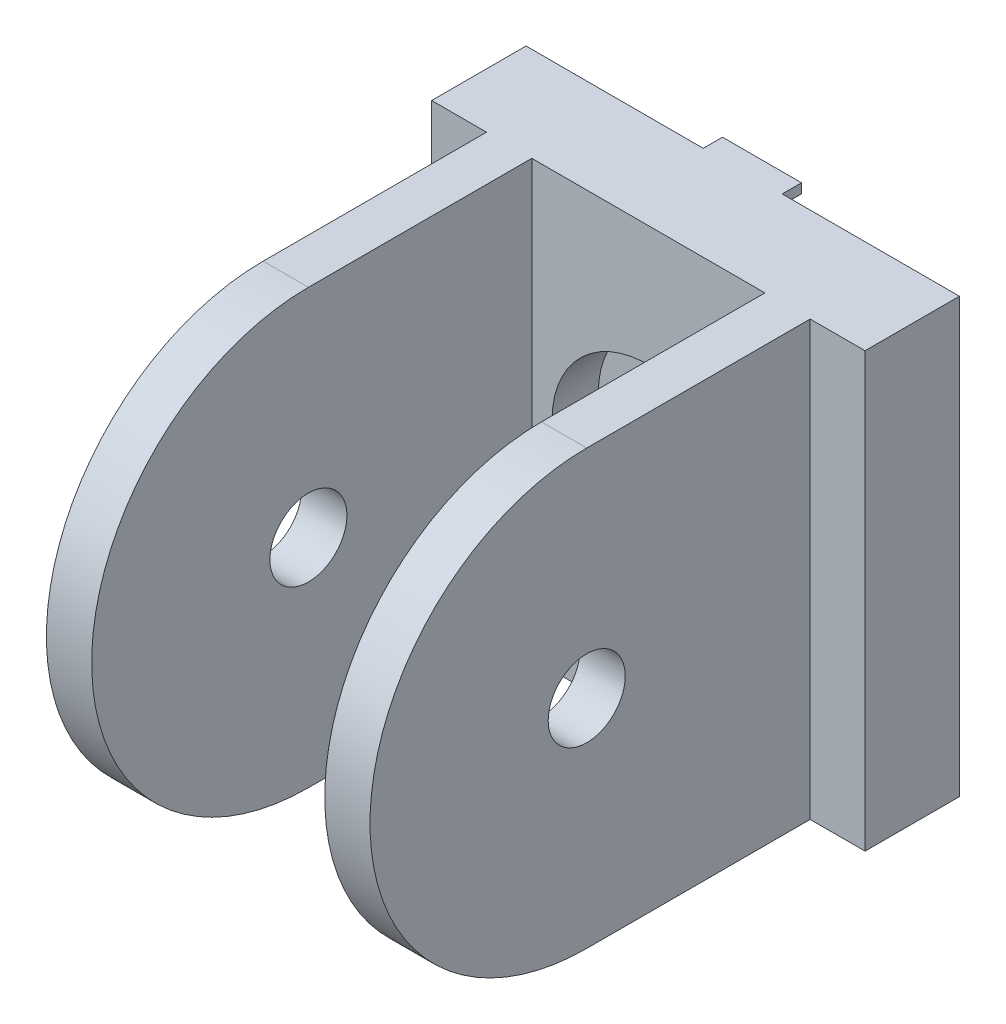
ISO-10303-21;
HEADER;
FILE_DESCRIPTION(('STEP AP214'),'2;1');
FILE_NAME('part.step','',(''),(''),'','','');
FILE_SCHEMA(('AUTOMOTIVE_DESIGN { 1 0 10303 214 1 1 1 1 }'));
ENDSEC;
DATA;
#1=APPLICATION_CONTEXT('core data for automotive mechanical design processes');
#2=APPLICATION_PROTOCOL_DEFINITION('international standard','automotive_design',2000,#1);
#3=PRODUCT_CONTEXT('',#1,'mechanical');
#4=PRODUCT('Part','Part','',(#3));
#5=PRODUCT_RELATED_PRODUCT_CATEGORY('part','',(#4));
#6=PRODUCT_DEFINITION_FORMATION('','',#4);
#7=PRODUCT_DEFINITION_CONTEXT('part definition',#1,'design');
#8=PRODUCT_DEFINITION('design','',#6,#7);
#9=PRODUCT_DEFINITION_SHAPE('','',#8);
#10=(LENGTH_UNIT() NAMED_UNIT(*) SI_UNIT(.MILLI.,.METRE.));
#11=(NAMED_UNIT(*) PLANE_ANGLE_UNIT() SI_UNIT($,.RADIAN.));
#12=(NAMED_UNIT(*) SI_UNIT($,.STERADIAN.) SOLID_ANGLE_UNIT());
#13=UNCERTAINTY_MEASURE_WITH_UNIT(LENGTH_MEASURE(1.E-05),#10,'distance_accuracy_value','');
#14=(GEOMETRIC_REPRESENTATION_CONTEXT(3) GLOBAL_UNCERTAINTY_ASSIGNED_CONTEXT((#13)) GLOBAL_UNIT_ASSIGNED_CONTEXT((#10,
#11,#12)) REPRESENTATION_CONTEXT('',''));
#15=CARTESIAN_POINT('',(0.,0.,0.));
#16=DIRECTION('',(0.,0.,1.));
#17=DIRECTION('',(1.,0.,0.));
#18=AXIS2_PLACEMENT_3D('',#15,#16,#17);
#19=CARTESIAN_POINT('',(0.,0.,0.));
#20=DIRECTION('',(0.,0.,1.));
#21=DIRECTION('',(1.,0.,0.));
#22=AXIS2_PLACEMENT_3D('',#19,#20,#21);
#23=CYLINDRICAL_SURFACE('',#22,6.1);
#24=CARTESIAN_POINT('',(0.,0.,0.));
#25=DIRECTION('',(0.,0.,1.));
#26=DIRECTION('',(1.,0.,0.));
#27=AXIS2_PLACEMENT_3D('',#24,#25,#26);
#28=CIRCLE('',#27,6.1);
#29=CARTESIAN_POINT('',(6.1,0.,0.));
#30=VERTEX_POINT('',#29);
#31=EDGE_CURVE('E317',#30,#30,#28,.T.);
#32=ORIENTED_EDGE('',*,*,#31,.F.);
#33=EDGE_LOOP('',(#32));
#34=FACE_BOUND('',#33,.T.);
#35=CARTESIAN_POINT('',(0.,0.,5.));
#36=DIRECTION('',(0.,0.,1.));
#37=DIRECTION('',(1.,0.,0.));
#38=AXIS2_PLACEMENT_3D('',#35,#36,#37);
#39=CIRCLE('',#38,6.1);
#40=CARTESIAN_POINT('',(6.1,0.,5.));
#41=VERTEX_POINT('',#40);
#42=EDGE_CURVE('E37',#41,#41,#39,.F.);
#43=ORIENTED_EDGE('',*,*,#42,.F.);
#44=EDGE_LOOP('',(#43));
#45=FACE_BOUND('',#44,.T.);
#46=ADVANCED_FACE('F33',(#34,#45),#23,.F.);
#47=CARTESIAN_POINT('',(22.5,22.5,0.));
#48=DIRECTION('',(0.,0.,-1.));
#49=DIRECTION('',(-1.,0.,0.));
#50=AXIS2_PLACEMENT_3D('',#47,#48,#49);
#51=PLANE('',#50);
#52=ORIENTED_EDGE('',*,*,#31,.T.);
#53=EDGE_LOOP('',(#52));
#54=FACE_BOUND('',#53,.T.);
#55=DIRECTION('',(1.,0.,0.));
#56=VECTOR('',#55,1.);
#57=CARTESIAN_POINT('',(4.09999999999999,-21.5,0.));
#58=LINE('',#57,#56);
#59=CARTESIAN_POINT('',(-4.09999999999999,-21.5,0.));
#60=VERTEX_POINT('',#59);
#61=CARTESIAN_POINT('',(4.1,-21.5,0.));
#62=VERTEX_POINT('',#61);
#63=EDGE_CURVE('E430',#60,#62,#58,.T.);
#64=ORIENTED_EDGE('',*,*,#63,.F.);
#65=DIRECTION('',(0.,1.,0.));
#66=VECTOR('',#65,1.);
#67=CARTESIAN_POINT('',(-4.09999999999999,-22.5,0.));
#68=LINE('',#67,#66);
#69=CARTESIAN_POINT('',(-4.09999999999999,-22.5,0.));
#70=VERTEX_POINT('',#69);
#71=EDGE_CURVE('E428',#70,#60,#68,.T.);
#72=ORIENTED_EDGE('',*,*,#71,.F.);
#73=DIRECTION('',(1.,0.,0.));
#74=VECTOR('',#73,1.);
#75=CARTESIAN_POINT('',(-22.5,-22.5,0.));
#76=LINE('',#75,#74);
#77=CARTESIAN_POINT('',(-22.5,-22.5,0.));
#78=VERTEX_POINT('',#77);
#79=EDGE_CURVE('E198',#78,#70,#76,.T.);
#80=ORIENTED_EDGE('',*,*,#79,.F.);
#81=DIRECTION('',(0.,-1.,0.));
#82=VECTOR('',#81,1.);
#83=CARTESIAN_POINT('',(-22.5,-22.5,0.));
#84=LINE('',#83,#82);
#85=CARTESIAN_POINT('',(-22.5,22.5,0.));
#86=VERTEX_POINT('',#85);
#87=EDGE_CURVE('E253',#86,#78,#84,.T.);
#88=ORIENTED_EDGE('',*,*,#87,.F.);
#89=DIRECTION('',(-1.,0.,0.));
#90=VECTOR('',#89,1.);
#91=CARTESIAN_POINT('',(-22.5,22.5,0.));
#92=LINE('',#91,#90);
#93=CARTESIAN_POINT('',(-4.10000000000001,22.5,0.));
#94=VERTEX_POINT('',#93);
#95=EDGE_CURVE('E243',#94,#86,#92,.T.);
#96=ORIENTED_EDGE('',*,*,#95,.F.);
#97=DIRECTION('',(0.,1.,0.));
#98=VECTOR('',#97,1.);
#99=CARTESIAN_POINT('',(-4.1,22.5,0.));
#100=LINE('',#99,#98);
#101=CARTESIAN_POINT('',(-4.1,21.5,0.));
#102=VERTEX_POINT('',#101);
#103=EDGE_CURVE('E210',#102,#94,#100,.T.);
#104=ORIENTED_EDGE('',*,*,#103,.F.);
#105=DIRECTION('',(-1.,0.,0.));
#106=VECTOR('',#105,1.);
#107=CARTESIAN_POINT('',(4.1,21.5,0.));
#108=LINE('',#107,#106);
#109=CARTESIAN_POINT('',(4.1,21.5,0.));
#110=VERTEX_POINT('',#109);
#111=EDGE_CURVE('E58',#110,#102,#108,.T.);
#112=ORIENTED_EDGE('',*,*,#111,.F.);
#113=DIRECTION('',(0.,-1.,0.));
#114=VECTOR('',#113,1.);
#115=CARTESIAN_POINT('',(4.1,22.5,0.));
#116=LINE('',#115,#114);
#117=CARTESIAN_POINT('',(4.09999999999999,22.5,0.));
#118=VERTEX_POINT('',#117);
#119=EDGE_CURVE('E199',#118,#110,#116,.T.);
#120=ORIENTED_EDGE('',*,*,#119,.F.);
#121=CARTESIAN_POINT('',(22.5,22.5,0.));
#122=VERTEX_POINT('',#121);
#123=EDGE_CURVE('E246',#122,#118,#92,.T.);
#124=ORIENTED_EDGE('',*,*,#123,.F.);
#125=DIRECTION('',(0.,1.,0.));
#126=VECTOR('',#125,1.);
#127=CARTESIAN_POINT('',(22.5,-22.5,0.));
#128=LINE('',#127,#126);
#129=CARTESIAN_POINT('',(22.5,-22.5,0.));
#130=VERTEX_POINT('',#129);
#131=EDGE_CURVE('E247',#130,#122,#128,.T.);
#132=ORIENTED_EDGE('',*,*,#131,.F.);
#133=CARTESIAN_POINT('',(4.09999999999999,-22.5,0.));
#134=VERTEX_POINT('',#133);
#135=EDGE_CURVE('E256',#134,#130,#76,.T.);
#136=ORIENTED_EDGE('',*,*,#135,.F.);
#137=DIRECTION('',(0.,-1.,0.));
#138=VECTOR('',#137,1.);
#139=CARTESIAN_POINT('',(4.09999999999999,-22.5,0.));
#140=LINE('',#139,#138);
#141=EDGE_CURVE('E191',#62,#134,#140,.T.);
#142=ORIENTED_EDGE('',*,*,#141,.F.);
#143=EDGE_LOOP('',(#64,#72,#80,#88,#96,#104,#112,#120,#124,#132,#136,#142));
#144=FACE_BOUND('',#143,.T.);
#145=ADVANCED_FACE('F390',(#54,#144),#51,.T.);
#146=CARTESIAN_POINT('',(-22.5,22.5,9.8));
#147=DIRECTION('',(0.,-1.,0.));
#148=DIRECTION('',(0.,0.,-1.));
#149=AXIS2_PLACEMENT_3D('',#146,#147,#148);
#150=PLANE('',#149);
#151=DIRECTION('',(1.,0.,0.));
#152=VECTOR('',#151,1.);
#153=CARTESIAN_POINT('',(-164.351113395739,22.5,33.));
#154=LINE('',#153,#152);
#155=CARTESIAN_POINT('',(12.1,22.5,33.));
#156=VERTEX_POINT('',#155);
#157=CARTESIAN_POINT('',(16.8,22.5,33.));
#158=VERTEX_POINT('',#157);
#159=EDGE_CURVE('E327',#156,#158,#154,.T.);
#160=ORIENTED_EDGE('',*,*,#159,.T.);
#161=DIRECTION('',(0.,0.,-1.));
#162=VECTOR('',#161,1.);
#163=CARTESIAN_POINT('',(16.8,22.5,55.5));
#164=LINE('',#163,#162);
#165=CARTESIAN_POINT('',(16.8,22.5,9.8));
#166=VERTEX_POINT('',#165);
#167=EDGE_CURVE('E354',#158,#166,#164,.T.);
#168=ORIENTED_EDGE('',*,*,#167,.T.);
#169=DIRECTION('',(-1.,0.,0.));
#170=VECTOR('',#169,1.);
#171=CARTESIAN_POINT('',(-22.5,22.5,9.8));
#172=LINE('',#171,#170);
#173=CARTESIAN_POINT('',(22.5,22.5,9.8));
#174=VERTEX_POINT('',#173);
#175=EDGE_CURVE('E267',#174,#166,#172,.T.);
#176=ORIENTED_EDGE('',*,*,#175,.F.);
#177=DIRECTION('',(0.,0.,-1.));
#178=VECTOR('',#177,1.);
#179=CARTESIAN_POINT('',(22.5,22.5,9.8));
#180=LINE('',#179,#178);
#181=EDGE_CURVE('E11',#174,#122,#180,.T.);
#182=ORIENTED_EDGE('',*,*,#181,.T.);
#183=ORIENTED_EDGE('',*,*,#123,.T.);
#184=DIRECTION('',(0.,0.,1.));
#185=VECTOR('',#184,1.);
#186=CARTESIAN_POINT('',(4.1,22.5,-2.));
#187=LINE('',#186,#185);
#188=CARTESIAN_POINT('',(4.1,22.5,-2.));
#189=VERTEX_POINT('',#188);
#190=EDGE_CURVE('E216',#189,#118,#187,.T.);
#191=ORIENTED_EDGE('',*,*,#190,.F.);
#192=DIRECTION('',(1.,0.,0.));
#193=VECTOR('',#192,1.);
#194=CARTESIAN_POINT('',(4.1,22.5,-2.));
#195=LINE('',#194,#193);
#196=CARTESIAN_POINT('',(-4.1,22.5,-2.));
#197=VERTEX_POINT('',#196);
#198=EDGE_CURVE('E214',#197,#189,#195,.T.);
#199=ORIENTED_EDGE('',*,*,#198,.F.);
#200=DIRECTION('',(0.,0.,1.));
#201=VECTOR('',#200,1.);
#202=CARTESIAN_POINT('',(-4.1,22.5,-2.));
#203=LINE('',#202,#201);
#204=EDGE_CURVE('E228',#197,#94,#203,.T.);
#205=ORIENTED_EDGE('',*,*,#204,.T.);
#206=ORIENTED_EDGE('',*,*,#95,.T.);
#207=DIRECTION('',(0.,0.,-1.));
#208=VECTOR('',#207,1.);
#209=CARTESIAN_POINT('',(-22.5,22.5,9.8));
#210=LINE('',#209,#208);
#211=CARTESIAN_POINT('',(-22.5,22.5,9.8));
#212=VERTEX_POINT('',#211);
#213=EDGE_CURVE('E42',#212,#86,#210,.T.);
#214=ORIENTED_EDGE('',*,*,#213,.F.);
#215=CARTESIAN_POINT('',(-16.8,22.5,9.8));
#216=VERTEX_POINT('',#215);
#217=EDGE_CURVE('E273',#216,#212,#172,.T.);
#218=ORIENTED_EDGE('',*,*,#217,.F.);
#219=DIRECTION('',(0.,0.,-1.));
#220=VECTOR('',#219,1.);
#221=CARTESIAN_POINT('',(-16.8,22.5,55.5));
#222=LINE('',#221,#220);
#223=CARTESIAN_POINT('',(-16.8,22.5,33.));
#224=VERTEX_POINT('',#223);
#225=EDGE_CURVE('E290',#224,#216,#222,.T.);
#226=ORIENTED_EDGE('',*,*,#225,.F.);
#227=CARTESIAN_POINT('',(-12.1,22.5,33.));
#228=VERTEX_POINT('',#227);
#229=EDGE_CURVE('E330',#224,#228,#154,.T.);
#230=ORIENTED_EDGE('',*,*,#229,.T.);
#231=DIRECTION('',(0.,0.,-1.));
#232=VECTOR('',#231,1.);
#233=CARTESIAN_POINT('',(-12.1,22.5,55.5));
#234=LINE('',#233,#232);
#235=CARTESIAN_POINT('',(-12.1,22.5,9.8));
#236=VERTEX_POINT('',#235);
#237=EDGE_CURVE('E304',#228,#236,#234,.T.);
#238=ORIENTED_EDGE('',*,*,#237,.T.);
#239=CARTESIAN_POINT('',(12.1,22.5,9.8));
#240=VERTEX_POINT('',#239);
#241=EDGE_CURVE('E272',#240,#236,#172,.T.);
#242=ORIENTED_EDGE('',*,*,#241,.F.);
#243=DIRECTION('',(0.,0.,-1.));
#244=VECTOR('',#243,1.);
#245=CARTESIAN_POINT('',(12.1,22.5,55.5));
#246=LINE('',#245,#244);
#247=EDGE_CURVE('E352',#156,#240,#246,.T.);
#248=ORIENTED_EDGE('',*,*,#247,.F.);
#249=EDGE_LOOP('',(#160,#168,#176,#182,#183,#191,#199,#205,#206,#214,#218,#226,#230,#238,#242,#248));
#250=FACE_BOUND('',#249,.T.);
#251=ADVANCED_FACE('F374',(#250),#150,.F.);
#252=CARTESIAN_POINT('',(22.5,22.5,9.8));
#253=DIRECTION('',(0.,0.,-1.));
#254=DIRECTION('',(-1.,0.,0.));
#255=AXIS2_PLACEMENT_3D('',#252,#253,#254);
#256=PLANE('',#255);
#257=DIRECTION('',(0.,1.,0.));
#258=VECTOR('',#257,1.);
#259=CARTESIAN_POINT('',(16.8,-22.5,9.8));
#260=LINE('',#259,#258);
#261=CARTESIAN_POINT('',(16.8,-22.5,9.8));
#262=VERTEX_POINT('',#261);
#263=EDGE_CURVE('E341',#262,#166,#260,.T.);
#264=ORIENTED_EDGE('',*,*,#263,.F.);
#265=DIRECTION('',(1.,0.,0.));
#266=VECTOR('',#265,1.);
#267=CARTESIAN_POINT('',(-22.5,-22.5,9.8));
#268=LINE('',#267,#266);
#269=CARTESIAN_POINT('',(22.5,-22.5,9.8));
#270=VERTEX_POINT('',#269);
#271=EDGE_CURVE('E285',#262,#270,#268,.T.);
#272=ORIENTED_EDGE('',*,*,#271,.T.);
#273=DIRECTION('',(0.,1.,0.));
#274=VECTOR('',#273,1.);
#275=CARTESIAN_POINT('',(22.5,-22.5,9.8));
#276=LINE('',#275,#274);
#277=EDGE_CURVE('E258',#270,#174,#276,.T.);
#278=ORIENTED_EDGE('',*,*,#277,.T.);
#279=ORIENTED_EDGE('',*,*,#175,.T.);
#280=EDGE_LOOP('',(#264,#272,#278,#279));
#281=FACE_BOUND('',#280,.T.);
#282=ADVANCED_FACE('F382',(#281),#256,.F.);
#283=CARTESIAN_POINT('',(0.,0.,9.8));
#284=DIRECTION('',(0.,0.,1.));
#285=DIRECTION('',(1.,0.,0.));
#286=AXIS2_PLACEMENT_3D('',#283,#284,#285);
#287=CIRCLE('',#286,10.);
#288=CARTESIAN_POINT('',(10.,0.,9.8));
#289=VERTEX_POINT('',#288);
#290=EDGE_CURVE('E441',#289,#289,#287,.T.);
#291=ORIENTED_EDGE('',*,*,#290,.F.);
#292=EDGE_LOOP('',(#291));
#293=FACE_BOUND('',#292,.T.);
#294=DIRECTION('',(0.,-1.,0.));
#295=VECTOR('',#294,1.);
#296=CARTESIAN_POINT('',(12.1,-22.5,9.8));
#297=LINE('',#296,#295);
#298=CARTESIAN_POINT('',(12.1,-22.5,9.8));
#299=VERTEX_POINT('',#298);
#300=EDGE_CURVE('E345',#240,#299,#297,.T.);
#301=ORIENTED_EDGE('',*,*,#300,.F.);
#302=ORIENTED_EDGE('',*,*,#241,.T.);
#303=DIRECTION('',(0.,1.,0.));
#304=VECTOR('',#303,1.);
#305=CARTESIAN_POINT('',(-12.1,-22.5,9.8));
#306=LINE('',#305,#304);
#307=CARTESIAN_POINT('',(-12.1,-22.5,9.8));
#308=VERTEX_POINT('',#307);
#309=EDGE_CURVE('E302',#308,#236,#306,.T.);
#310=ORIENTED_EDGE('',*,*,#309,.F.);
#311=EDGE_CURVE('E406',#308,#299,#268,.T.);
#312=ORIENTED_EDGE('',*,*,#311,.T.);
#313=EDGE_LOOP('',(#301,#302,#310,#312));
#314=FACE_BOUND('',#313,.T.);
#315=ADVANCED_FACE('F414',(#293,#314),#256,.F.);
#316=DIRECTION('',(0.,-1.,0.));
#317=VECTOR('',#316,1.);
#318=CARTESIAN_POINT('',(-16.8,-22.5,9.8));
#319=LINE('',#318,#317);
#320=CARTESIAN_POINT('',(-16.8,-22.5,9.8));
#321=VERTEX_POINT('',#320);
#322=EDGE_CURVE('E296',#216,#321,#319,.T.);
#323=ORIENTED_EDGE('',*,*,#322,.F.);
#324=ORIENTED_EDGE('',*,*,#217,.T.);
#325=DIRECTION('',(0.,-1.,0.));
#326=VECTOR('',#325,1.);
#327=CARTESIAN_POINT('',(-22.5,-22.5,9.8));
#328=LINE('',#327,#326);
#329=CARTESIAN_POINT('',(-22.5,-22.5,9.8));
#330=VERTEX_POINT('',#329);
#331=EDGE_CURVE('E271',#212,#330,#328,.T.);
#332=ORIENTED_EDGE('',*,*,#331,.T.);
#333=EDGE_CURVE('E263',#330,#321,#268,.T.);
#334=ORIENTED_EDGE('',*,*,#333,.T.);
#335=EDGE_LOOP('',(#323,#324,#332,#334));
#336=FACE_BOUND('',#335,.T.);
#337=ADVANCED_FACE('F371',(#336),#256,.F.);
#338=CARTESIAN_POINT('',(22.5,-22.5,9.8));
#339=DIRECTION('',(-1.,0.,0.));
#340=DIRECTION('',(0.,0.,1.));
#341=AXIS2_PLACEMENT_3D('',#338,#339,#340);
#342=PLANE('',#341);
#343=ORIENTED_EDGE('',*,*,#131,.T.);
#344=ORIENTED_EDGE('',*,*,#181,.F.);
#345=ORIENTED_EDGE('',*,*,#277,.F.);
#346=DIRECTION('',(0.,0.,-1.));
#347=VECTOR('',#346,1.);
#348=CARTESIAN_POINT('',(22.5,-22.5,9.8));
#349=LINE('',#348,#347);
#350=EDGE_CURVE('E259',#270,#130,#349,.T.);
#351=ORIENTED_EDGE('',*,*,#350,.T.);
#352=EDGE_LOOP('',(#343,#344,#345,#351));
#353=FACE_BOUND('',#352,.T.);
#354=ADVANCED_FACE('F35',(#353),#342,.F.);
#355=CARTESIAN_POINT('',(-22.5,-22.5,9.8));
#356=DIRECTION('',(1.,0.,0.));
#357=DIRECTION('',(0.,0.,-1.));
#358=AXIS2_PLACEMENT_3D('',#355,#356,#357);
#359=PLANE('',#358);
#360=ORIENTED_EDGE('',*,*,#87,.T.);
#361=DIRECTION('',(0.,0.,-1.));
#362=VECTOR('',#361,1.);
#363=CARTESIAN_POINT('',(-22.5,-22.5,9.8));
#364=LINE('',#363,#362);
#365=EDGE_CURVE('E262',#330,#78,#364,.T.);
#366=ORIENTED_EDGE('',*,*,#365,.F.);
#367=ORIENTED_EDGE('',*,*,#331,.F.);
#368=ORIENTED_EDGE('',*,*,#213,.T.);
#369=EDGE_LOOP('',(#360,#366,#367,#368));
#370=FACE_BOUND('',#369,.T.);
#371=ADVANCED_FACE('F404',(#370),#359,.F.);
#372=CARTESIAN_POINT('',(-22.5,-22.5,9.8));
#373=DIRECTION('',(0.,1.,0.));
#374=DIRECTION('',(0.,0.,1.));
#375=AXIS2_PLACEMENT_3D('',#372,#373,#374);
#376=PLANE('',#375);
#377=DIRECTION('',(0.,0.,-1.));
#378=VECTOR('',#377,1.);
#379=CARTESIAN_POINT('',(16.8,-22.5,55.5));
#380=LINE('',#379,#378);
#381=CARTESIAN_POINT('',(16.8,-22.5,33.));
#382=VERTEX_POINT('',#381);
#383=EDGE_CURVE('E348',#382,#262,#380,.T.);
#384=ORIENTED_EDGE('',*,*,#383,.F.);
#385=DIRECTION('',(1.,0.,0.));
#386=VECTOR('',#385,1.);
#387=CARTESIAN_POINT('',(-164.351113395739,-22.5,33.));
#388=LINE('',#387,#386);
#389=CARTESIAN_POINT('',(12.1,-22.5,33.));
#390=VERTEX_POINT('',#389);
#391=EDGE_CURVE('E326',#390,#382,#388,.T.);
#392=ORIENTED_EDGE('',*,*,#391,.F.);
#393=DIRECTION('',(0.,0.,-1.));
#394=VECTOR('',#393,1.);
#395=CARTESIAN_POINT('',(12.1,-22.5,55.5));
#396=LINE('',#395,#394);
#397=EDGE_CURVE('E350',#390,#299,#396,.T.);
#398=ORIENTED_EDGE('',*,*,#397,.T.);
#399=ORIENTED_EDGE('',*,*,#311,.F.);
#400=DIRECTION('',(0.,0.,-1.));
#401=VECTOR('',#400,1.);
#402=CARTESIAN_POINT('',(-12.1,-22.5,55.5));
#403=LINE('',#402,#401);
#404=CARTESIAN_POINT('',(-12.1,-22.5,33.));
#405=VERTEX_POINT('',#404);
#406=EDGE_CURVE('E291',#405,#308,#403,.T.);
#407=ORIENTED_EDGE('',*,*,#406,.F.);
#408=CARTESIAN_POINT('',(-16.8,-22.5,33.));
#409=VERTEX_POINT('',#408);
#410=EDGE_CURVE('E331',#409,#405,#388,.T.);
#411=ORIENTED_EDGE('',*,*,#410,.F.);
#412=DIRECTION('',(0.,0.,-1.));
#413=VECTOR('',#412,1.);
#414=CARTESIAN_POINT('',(-16.8,-22.5,55.5));
#415=LINE('',#414,#413);
#416=EDGE_CURVE('E287',#409,#321,#415,.T.);
#417=ORIENTED_EDGE('',*,*,#416,.T.);
#418=ORIENTED_EDGE('',*,*,#333,.F.);
#419=ORIENTED_EDGE('',*,*,#365,.T.);
#420=ORIENTED_EDGE('',*,*,#79,.T.);
#421=DIRECTION('',(0.,0.,1.));
#422=VECTOR('',#421,1.);
#423=CARTESIAN_POINT('',(-4.09999999999999,-22.5,-2.));
#424=LINE('',#423,#422);
#425=CARTESIAN_POINT('',(-4.09999999999999,-22.5,-2.));
#426=VERTEX_POINT('',#425);
#427=EDGE_CURVE('E176',#426,#70,#424,.T.);
#428=ORIENTED_EDGE('',*,*,#427,.F.);
#429=DIRECTION('',(-1.,0.,0.));
#430=VECTOR('',#429,1.);
#431=CARTESIAN_POINT('',(4.09999999999999,-22.5,-2.));
#432=LINE('',#431,#430);
#433=CARTESIAN_POINT('',(4.09999999999999,-22.5,-2.));
#434=VERTEX_POINT('',#433);
#435=EDGE_CURVE('E183',#434,#426,#432,.T.);
#436=ORIENTED_EDGE('',*,*,#435,.F.);
#437=DIRECTION('',(0.,0.,1.));
#438=VECTOR('',#437,1.);
#439=CARTESIAN_POINT('',(4.09999999999999,-22.5,-2.));
#440=LINE('',#439,#438);
#441=EDGE_CURVE('E439',#434,#134,#440,.T.);
#442=ORIENTED_EDGE('',*,*,#441,.T.);
#443=ORIENTED_EDGE('',*,*,#135,.T.);
#444=ORIENTED_EDGE('',*,*,#350,.F.);
#445=ORIENTED_EDGE('',*,*,#271,.F.);
#446=EDGE_LOOP('',(#384,#392,#398,#399,#407,#411,#417,#418,#419,#420,#428,#436,#442,#443,#444,#445));
#447=FACE_BOUND('',#446,.T.);
#448=ADVANCED_FACE('F195',(#447),#376,.F.);
#449=CARTESIAN_POINT('',(-12.1,-22.5,55.5));
#450=DIRECTION('',(-1.,0.,0.));
#451=DIRECTION('',(0.,0.,1.));
#452=AXIS2_PLACEMENT_3D('',#449,#450,#451);
#453=PLANE('',#452);
#454=CARTESIAN_POINT('',(-12.1,0.,33.));
#455=DIRECTION('',(-1.,0.,0.));
#456=DIRECTION('',(0.,0.,1.));
#457=AXIS2_PLACEMENT_3D('',#454,#455,#456);
#458=CIRCLE('',#457,4.00000000000001);
#459=CARTESIAN_POINT('',(-12.1,0.,37.));
#460=VERTEX_POINT('',#459);
#461=EDGE_CURVE('E314',#460,#460,#458,.T.);
#462=ORIENTED_EDGE('',*,*,#461,.T.);
#463=EDGE_LOOP('',(#462));
#464=FACE_BOUND('',#463,.T.);
#465=CARTESIAN_POINT('',(-12.1,0.,33.));
#466=DIRECTION('',(-1.,0.,0.));
#467=DIRECTION('',(0.,0.,1.));
#468=AXIS2_PLACEMENT_3D('',#465,#466,#467);
#469=CIRCLE('',#468,22.5);
#470=EDGE_CURVE('E336',#228,#405,#469,.F.);
#471=ORIENTED_EDGE('',*,*,#470,.T.);
#472=ORIENTED_EDGE('',*,*,#406,.T.);
#473=ORIENTED_EDGE('',*,*,#309,.T.);
#474=ORIENTED_EDGE('',*,*,#237,.F.);
#475=EDGE_LOOP('',(#471,#472,#473,#474));
#476=FACE_BOUND('',#475,.T.);
#477=ADVANCED_FACE('F423',(#464,#476),#453,.F.);
#478=CARTESIAN_POINT('',(-16.8,-22.5,55.5));
#479=DIRECTION('',(1.,0.,0.));
#480=DIRECTION('',(0.,0.,-1.));
#481=AXIS2_PLACEMENT_3D('',#478,#479,#480);
#482=PLANE('',#481);
#483=CARTESIAN_POINT('',(-16.8,0.,33.));
#484=DIRECTION('',(-1.,0.,0.));
#485=DIRECTION('',(0.,0.,1.));
#486=AXIS2_PLACEMENT_3D('',#483,#484,#485);
#487=CIRCLE('',#486,4.00000000000001);
#488=CARTESIAN_POINT('',(-16.8,0.,37.));
#489=VERTEX_POINT('',#488);
#490=EDGE_CURVE('E310',#489,#489,#487,.T.);
#491=ORIENTED_EDGE('',*,*,#490,.F.);
#492=EDGE_LOOP('',(#491));
#493=FACE_BOUND('',#492,.T.);
#494=ORIENTED_EDGE('',*,*,#416,.F.);
#495=CARTESIAN_POINT('',(-16.8,0.,33.));
#496=DIRECTION('',(1.,0.,0.));
#497=DIRECTION('',(0.,0.,-1.));
#498=AXIS2_PLACEMENT_3D('',#495,#496,#497);
#499=CIRCLE('',#498,22.5);
#500=EDGE_CURVE('E339',#409,#224,#499,.F.);
#501=ORIENTED_EDGE('',*,*,#500,.T.);
#502=ORIENTED_EDGE('',*,*,#225,.T.);
#503=ORIENTED_EDGE('',*,*,#322,.T.);
#504=EDGE_LOOP('',(#494,#501,#502,#503));
#505=FACE_BOUND('',#504,.T.);
#506=ADVANCED_FACE('F366',(#493,#505),#482,.F.);
#507=CARTESIAN_POINT('',(16.8,-22.5,55.5));
#508=DIRECTION('',(-1.,0.,0.));
#509=DIRECTION('',(0.,0.,1.));
#510=AXIS2_PLACEMENT_3D('',#507,#508,#509);
#511=PLANE('',#510);
#512=CARTESIAN_POINT('',(16.8,0.,33.));
#513=DIRECTION('',(-1.,0.,0.));
#514=DIRECTION('',(0.,0.,1.));
#515=AXIS2_PLACEMENT_3D('',#512,#513,#514);
#516=CIRCLE('',#515,4.00000000000001);
#517=CARTESIAN_POINT('',(16.8,0.,37.));
#518=VERTEX_POINT('',#517);
#519=EDGE_CURVE('E309',#518,#518,#516,.T.);
#520=ORIENTED_EDGE('',*,*,#519,.T.);
#521=EDGE_LOOP('',(#520));
#522=FACE_BOUND('',#521,.T.);
#523=CARTESIAN_POINT('',(16.8,0.,33.));
#524=DIRECTION('',(-1.,0.,0.));
#525=DIRECTION('',(0.,0.,1.));
#526=AXIS2_PLACEMENT_3D('',#523,#524,#525);
#527=CIRCLE('',#526,22.5);
#528=EDGE_CURVE('E337',#158,#382,#527,.F.);
#529=ORIENTED_EDGE('',*,*,#528,.T.);
#530=ORIENTED_EDGE('',*,*,#383,.T.);
#531=ORIENTED_EDGE('',*,*,#263,.T.);
#532=ORIENTED_EDGE('',*,*,#167,.F.);
#533=EDGE_LOOP('',(#529,#530,#531,#532));
#534=FACE_BOUND('',#533,.T.);
#535=ADVANCED_FACE('F485',(#522,#534),#511,.F.);
#536=CARTESIAN_POINT('',(12.1,-22.5,55.5));
#537=DIRECTION('',(1.,0.,0.));
#538=DIRECTION('',(0.,0.,-1.));
#539=AXIS2_PLACEMENT_3D('',#536,#537,#538);
#540=PLANE('',#539);
#541=CARTESIAN_POINT('',(12.1,0.,33.));
#542=DIRECTION('',(1.,0.,0.));
#543=DIRECTION('',(0.,0.,-1.));
#544=AXIS2_PLACEMENT_3D('',#541,#542,#543);
#545=CIRCLE('',#544,4.00000000000001);
#546=CARTESIAN_POINT('',(12.1,0.,29.));
#547=VERTEX_POINT('',#546);
#548=EDGE_CURVE('E306',#547,#547,#545,.T.);
#549=ORIENTED_EDGE('',*,*,#548,.T.);
#550=EDGE_LOOP('',(#549));
#551=FACE_BOUND('',#550,.T.);
#552=ORIENTED_EDGE('',*,*,#397,.F.);
#553=CARTESIAN_POINT('',(12.1,0.,33.));
#554=DIRECTION('',(1.,0.,0.));
#555=DIRECTION('',(0.,0.,-1.));
#556=AXIS2_PLACEMENT_3D('',#553,#554,#555);
#557=CIRCLE('',#556,22.5);
#558=EDGE_CURVE('E334',#390,#156,#557,.F.);
#559=ORIENTED_EDGE('',*,*,#558,.T.);
#560=ORIENTED_EDGE('',*,*,#247,.T.);
#561=ORIENTED_EDGE('',*,*,#300,.T.);
#562=EDGE_LOOP('',(#552,#559,#560,#561));
#563=FACE_BOUND('',#562,.T.);
#564=ADVANCED_FACE('F419',(#551,#563),#540,.F.);
#565=CARTESIAN_POINT('',(-164.351113395739,0.,33.));
#566=DIRECTION('',(1.,0.,0.));
#567=DIRECTION('',(0.,0.,-1.));
#568=AXIS2_PLACEMENT_3D('',#565,#566,#567);
#569=CYLINDRICAL_SURFACE('',#568,22.5);
#570=ORIENTED_EDGE('',*,*,#391,.T.);
#571=ORIENTED_EDGE('',*,*,#528,.F.);
#572=ORIENTED_EDGE('',*,*,#159,.F.);
#573=ORIENTED_EDGE('',*,*,#558,.F.);
#574=EDGE_LOOP('',(#570,#571,#572,#573));
#575=FACE_BOUND('',#574,.T.);
#576=ADVANCED_FACE('F482',(#575),#569,.T.);
#577=ORIENTED_EDGE('',*,*,#410,.T.);
#578=ORIENTED_EDGE('',*,*,#470,.F.);
#579=ORIENTED_EDGE('',*,*,#229,.F.);
#580=ORIENTED_EDGE('',*,*,#500,.F.);
#581=EDGE_LOOP('',(#577,#578,#579,#580));
#582=FACE_BOUND('',#581,.T.);
#583=ADVANCED_FACE('F427',(#582),#569,.T.);
#584=CARTESIAN_POINT('',(22.5,0.,33.));
#585=DIRECTION('',(-1.,0.,0.));
#586=DIRECTION('',(0.,0.,1.));
#587=AXIS2_PLACEMENT_3D('',#584,#585,#586);
#588=CYLINDRICAL_SURFACE('',#587,4.00000000000001);
#589=ORIENTED_EDGE('',*,*,#548,.F.);
#590=EDGE_LOOP('',(#589));
#591=FACE_BOUND('',#590,.T.);
#592=ORIENTED_EDGE('',*,*,#519,.F.);
#593=EDGE_LOOP('',(#592));
#594=FACE_BOUND('',#593,.T.);
#595=ADVANCED_FACE('F479',(#591,#594),#588,.F.);
#596=ORIENTED_EDGE('',*,*,#490,.T.);
#597=EDGE_LOOP('',(#596));
#598=FACE_BOUND('',#597,.T.);
#599=ORIENTED_EDGE('',*,*,#461,.F.);
#600=EDGE_LOOP('',(#599));
#601=FACE_BOUND('',#600,.T.);
#602=ADVANCED_FACE('F476',(#598,#601),#588,.F.);
#603=CARTESIAN_POINT('',(4.1,22.5,-2.));
#604=DIRECTION('',(-1.,0.,0.));
#605=DIRECTION('',(0.,0.,1.));
#606=AXIS2_PLACEMENT_3D('',#603,#604,#605);
#607=PLANE('',#606);
#608=ORIENTED_EDGE('',*,*,#119,.T.);
#609=DIRECTION('',(0.,0.,1.));
#610=VECTOR('',#609,1.);
#611=CARTESIAN_POINT('',(4.1,21.5,-2.));
#612=LINE('',#611,#610);
#613=CARTESIAN_POINT('',(4.1,21.5,-2.));
#614=VERTEX_POINT('',#613);
#615=EDGE_CURVE('E235',#614,#110,#612,.T.);
#616=ORIENTED_EDGE('',*,*,#615,.F.);
#617=DIRECTION('',(0.,-1.,0.));
#618=VECTOR('',#617,1.);
#619=CARTESIAN_POINT('',(4.1,22.5,-2.));
#620=LINE('',#619,#618);
#621=EDGE_CURVE('E206',#189,#614,#620,.T.);
#622=ORIENTED_EDGE('',*,*,#621,.F.);
#623=ORIENTED_EDGE('',*,*,#190,.T.);
#624=EDGE_LOOP('',(#608,#616,#622,#623));
#625=FACE_BOUND('',#624,.T.);
#626=ADVANCED_FACE('F393',(#625),#607,.F.);
#627=CARTESIAN_POINT('',(4.1,21.5,-2.));
#628=DIRECTION('',(0.,1.,0.));
#629=DIRECTION('',(0.,0.,1.));
#630=AXIS2_PLACEMENT_3D('',#627,#628,#629);
#631=PLANE('',#630);
#632=ORIENTED_EDGE('',*,*,#111,.T.);
#633=DIRECTION('',(0.,0.,1.));
#634=VECTOR('',#633,1.);
#635=CARTESIAN_POINT('',(-4.1,21.5,-2.));
#636=LINE('',#635,#634);
#637=CARTESIAN_POINT('',(-4.1,21.5,-2.));
#638=VERTEX_POINT('',#637);
#639=EDGE_CURVE('E220',#638,#102,#636,.T.);
#640=ORIENTED_EDGE('',*,*,#639,.F.);
#641=DIRECTION('',(-1.,0.,0.));
#642=VECTOR('',#641,1.);
#643=CARTESIAN_POINT('',(4.1,21.5,-2.));
#644=LINE('',#643,#642);
#645=EDGE_CURVE('E209',#614,#638,#644,.T.);
#646=ORIENTED_EDGE('',*,*,#645,.F.);
#647=ORIENTED_EDGE('',*,*,#615,.T.);
#648=EDGE_LOOP('',(#632,#640,#646,#647));
#649=FACE_BOUND('',#648,.T.);
#650=ADVANCED_FACE('F395',(#649),#631,.F.);
#651=CARTESIAN_POINT('',(-4.1,22.5,-2.));
#652=DIRECTION('',(1.,0.,0.));
#653=DIRECTION('',(0.,0.,-1.));
#654=AXIS2_PLACEMENT_3D('',#651,#652,#653);
#655=PLANE('',#654);
#656=ORIENTED_EDGE('',*,*,#103,.T.);
#657=ORIENTED_EDGE('',*,*,#204,.F.);
#658=DIRECTION('',(0.,1.,0.));
#659=VECTOR('',#658,1.);
#660=CARTESIAN_POINT('',(-4.1,22.5,-2.));
#661=LINE('',#660,#659);
#662=EDGE_CURVE('E212',#638,#197,#661,.T.);
#663=ORIENTED_EDGE('',*,*,#662,.F.);
#664=ORIENTED_EDGE('',*,*,#639,.T.);
#665=EDGE_LOOP('',(#656,#657,#663,#664));
#666=FACE_BOUND('',#665,.T.);
#667=ADVANCED_FACE('F401',(#666),#655,.F.);
#668=CARTESIAN_POINT('',(4.1,21.5,-2.));
#669=DIRECTION('',(0.,0.,-1.));
#670=DIRECTION('',(-1.,0.,0.));
#671=AXIS2_PLACEMENT_3D('',#668,#669,#670);
#672=PLANE('',#671);
#673=ORIENTED_EDGE('',*,*,#621,.T.);
#674=ORIENTED_EDGE('',*,*,#645,.T.);
#675=ORIENTED_EDGE('',*,*,#662,.T.);
#676=ORIENTED_EDGE('',*,*,#198,.T.);
#677=EDGE_LOOP('',(#673,#674,#675,#676));
#678=FACE_BOUND('',#677,.T.);
#679=ADVANCED_FACE('F399',(#678),#672,.T.);
#680=CARTESIAN_POINT('',(-4.09999999999999,-22.5,-2.));
#681=DIRECTION('',(1.,0.,0.));
#682=DIRECTION('',(0.,0.,-1.));
#683=AXIS2_PLACEMENT_3D('',#680,#681,#682);
#684=PLANE('',#683);
#685=ORIENTED_EDGE('',*,*,#71,.T.);
#686=DIRECTION('',(0.,0.,1.));
#687=VECTOR('',#686,1.);
#688=CARTESIAN_POINT('',(-4.09999999999999,-21.5,-2.));
#689=LINE('',#688,#687);
#690=CARTESIAN_POINT('',(-4.09999999999999,-21.5,-2.));
#691=VERTEX_POINT('',#690);
#692=EDGE_CURVE('E179',#691,#60,#689,.T.);
#693=ORIENTED_EDGE('',*,*,#692,.F.);
#694=DIRECTION('',(0.,1.,0.));
#695=VECTOR('',#694,1.);
#696=CARTESIAN_POINT('',(-4.09999999999999,-22.5,-2.));
#697=LINE('',#696,#695);
#698=EDGE_CURVE('E172',#426,#691,#697,.T.);
#699=ORIENTED_EDGE('',*,*,#698,.F.);
#700=ORIENTED_EDGE('',*,*,#427,.T.);
#701=EDGE_LOOP('',(#685,#693,#699,#700));
#702=FACE_BOUND('',#701,.T.);
#703=ADVANCED_FACE('F174',(#702),#684,.F.);
#704=CARTESIAN_POINT('',(4.09999999999999,-21.5,-2.));
#705=DIRECTION('',(0.,-1.,0.));
#706=DIRECTION('',(0.,0.,-1.));
#707=AXIS2_PLACEMENT_3D('',#704,#705,#706);
#708=PLANE('',#707);
#709=ORIENTED_EDGE('',*,*,#63,.T.);
#710=DIRECTION('',(0.,0.,1.));
#711=VECTOR('',#710,1.);
#712=CARTESIAN_POINT('',(4.09999999999999,-21.5,-2.));
#713=LINE('',#712,#711);
#714=CARTESIAN_POINT('',(4.09999999999999,-21.5,-2.));
#715=VERTEX_POINT('',#714);
#716=EDGE_CURVE('E50',#715,#62,#713,.T.);
#717=ORIENTED_EDGE('',*,*,#716,.F.);
#718=DIRECTION('',(1.,0.,0.));
#719=VECTOR('',#718,1.);
#720=CARTESIAN_POINT('',(4.09999999999999,-21.5,-2.));
#721=LINE('',#720,#719);
#722=EDGE_CURVE('E182',#691,#715,#721,.T.);
#723=ORIENTED_EDGE('',*,*,#722,.F.);
#724=ORIENTED_EDGE('',*,*,#692,.T.);
#725=EDGE_LOOP('',(#709,#717,#723,#724));
#726=FACE_BOUND('',#725,.T.);
#727=ADVANCED_FACE('F630',(#726),#708,.F.);
#728=CARTESIAN_POINT('',(4.09999999999999,-22.5,-2.));
#729=DIRECTION('',(-1.,0.,0.));
#730=DIRECTION('',(0.,0.,1.));
#731=AXIS2_PLACEMENT_3D('',#728,#729,#730);
#732=PLANE('',#731);
#733=ORIENTED_EDGE('',*,*,#141,.T.);
#734=ORIENTED_EDGE('',*,*,#441,.F.);
#735=DIRECTION('',(0.,-1.,0.));
#736=VECTOR('',#735,1.);
#737=CARTESIAN_POINT('',(4.09999999999999,-22.5,-2.));
#738=LINE('',#737,#736);
#739=EDGE_CURVE('E187',#715,#434,#738,.T.);
#740=ORIENTED_EDGE('',*,*,#739,.F.);
#741=ORIENTED_EDGE('',*,*,#716,.T.);
#742=EDGE_LOOP('',(#733,#734,#740,#741));
#743=FACE_BOUND('',#742,.T.);
#744=ADVANCED_FACE('F638',(#743),#732,.F.);
#745=CARTESIAN_POINT('',(-4.09999999999999,-22.5,-2.));
#746=DIRECTION('',(0.,0.,-1.));
#747=DIRECTION('',(-1.,0.,0.));
#748=AXIS2_PLACEMENT_3D('',#745,#746,#747);
#749=PLANE('',#748);
#750=ORIENTED_EDGE('',*,*,#435,.T.);
#751=ORIENTED_EDGE('',*,*,#698,.T.);
#752=ORIENTED_EDGE('',*,*,#722,.T.);
#753=ORIENTED_EDGE('',*,*,#739,.T.);
#754=EDGE_LOOP('',(#750,#751,#752,#753));
#755=FACE_BOUND('',#754,.T.);
#756=ADVANCED_FACE('F186',(#755),#749,.T.);
#757=CARTESIAN_POINT('',(0.,0.,5.));
#758=DIRECTION('',(0.,0.,1.));
#759=DIRECTION('',(1.,0.,0.));
#760=AXIS2_PLACEMENT_3D('',#757,#758,#759);
#761=PLANE('',#760);
#762=CARTESIAN_POINT('',(0.,0.,5.));
#763=DIRECTION('',(0.,0.,1.));
#764=DIRECTION('',(1.,0.,0.));
#765=AXIS2_PLACEMENT_3D('',#762,#763,#764);
#766=CIRCLE('',#765,10.);
#767=CARTESIAN_POINT('',(10.,0.,5.));
#768=VERTEX_POINT('',#767);
#769=EDGE_CURVE('E434',#768,#768,#766,.T.);
#770=ORIENTED_EDGE('',*,*,#769,.T.);
#771=EDGE_LOOP('',(#770));
#772=FACE_BOUND('',#771,.T.);
#773=ORIENTED_EDGE('',*,*,#42,.T.);
#774=EDGE_LOOP('',(#773));
#775=FACE_BOUND('',#774,.T.);
#776=ADVANCED_FACE('F447',(#772,#775),#761,.T.);
#777=CARTESIAN_POINT('',(0.,0.,5.));
#778=DIRECTION('',(0.,0.,1.));
#779=DIRECTION('',(1.,0.,0.));
#780=AXIS2_PLACEMENT_3D('',#777,#778,#779);
#781=CYLINDRICAL_SURFACE('',#780,10.);
#782=ORIENTED_EDGE('',*,*,#769,.F.);
#783=EDGE_LOOP('',(#782));
#784=FACE_BOUND('',#783,.T.);
#785=ORIENTED_EDGE('',*,*,#290,.T.);
#786=EDGE_LOOP('',(#785));
#787=FACE_BOUND('',#786,.T.);
#788=ADVANCED_FACE('F450',(#784,#787),#781,.F.);
#789=CLOSED_SHELL('',(#46,#145,#251,#282,#315,#337,#354,#371,#448,#477,#506,#535,#564,#576,#583,
#595,#602,#626,#650,#667,#679,#703,#727,#744,#756,#776,#788));
#790=MANIFOLD_SOLID_BREP('B2',#789);
#791=ADVANCED_BREP_SHAPE_REPRESENTATION('',(#18,#790),#14);
#792=SHAPE_DEFINITION_REPRESENTATION(#9,#791);
ENDSEC;
END-ISO-10303-21;
